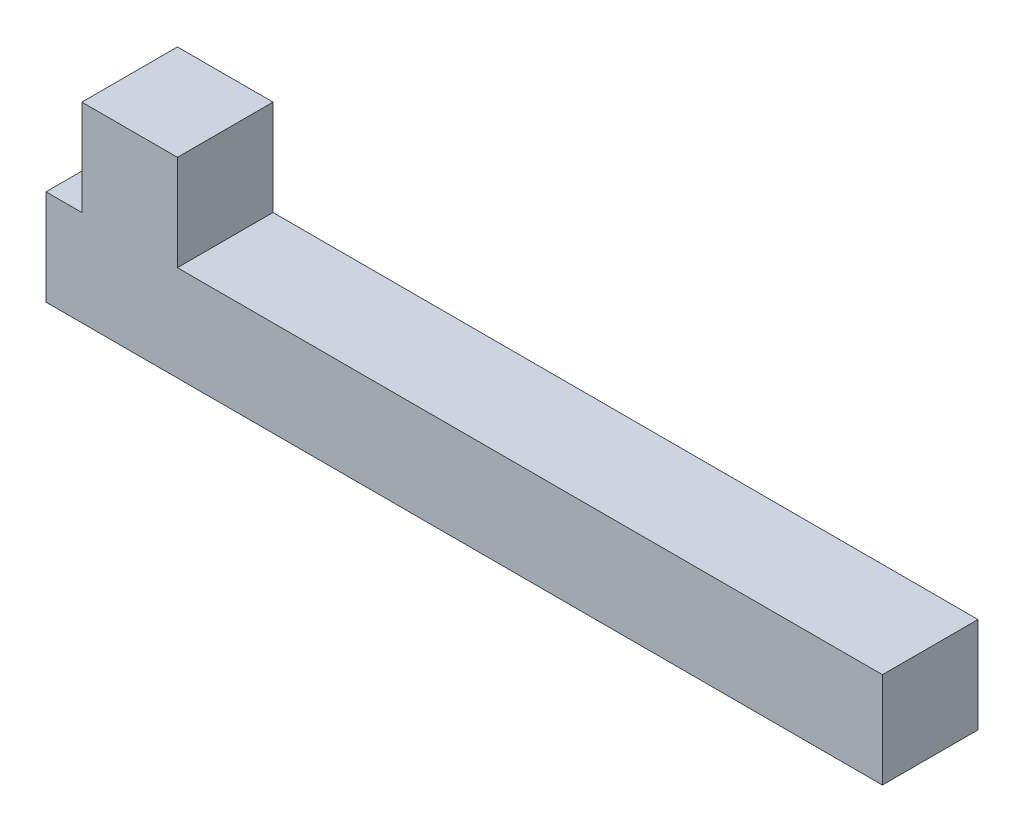
ISO-10303-21;
HEADER;
FILE_DESCRIPTION(('STEP AP214'),'2;1');
FILE_NAME('part.step','',(''),(''),'','','');
FILE_SCHEMA(('AUTOMOTIVE_DESIGN { 1 0 10303 214 1 1 1 1 }'));
ENDSEC;
DATA;
#1=APPLICATION_CONTEXT('core data for automotive mechanical design processes');
#2=APPLICATION_PROTOCOL_DEFINITION('international standard','automotive_design',2000,#1);
#3=PRODUCT_CONTEXT('',#1,'mechanical');
#4=PRODUCT('Part','Part','',(#3));
#5=PRODUCT_RELATED_PRODUCT_CATEGORY('part','',(#4));
#6=PRODUCT_DEFINITION_FORMATION('','',#4);
#7=PRODUCT_DEFINITION_CONTEXT('part definition',#1,'design');
#8=PRODUCT_DEFINITION('design','',#6,#7);
#9=PRODUCT_DEFINITION_SHAPE('','',#8);
#10=(LENGTH_UNIT() NAMED_UNIT(*) SI_UNIT(.MILLI.,.METRE.));
#11=(NAMED_UNIT(*) PLANE_ANGLE_UNIT() SI_UNIT($,.RADIAN.));
#12=(NAMED_UNIT(*) SI_UNIT($,.STERADIAN.) SOLID_ANGLE_UNIT());
#13=UNCERTAINTY_MEASURE_WITH_UNIT(LENGTH_MEASURE(1.E-05),#10,'distance_accuracy_value','');
#14=(GEOMETRIC_REPRESENTATION_CONTEXT(3) GLOBAL_UNCERTAINTY_ASSIGNED_CONTEXT((#13)) GLOBAL_UNIT_ASSIGNED_CONTEXT((#10,
#11,#12)) REPRESENTATION_CONTEXT('',''));
#15=CARTESIAN_POINT('',(0.,0.,0.));
#16=DIRECTION('',(0.,0.,1.));
#17=DIRECTION('',(1.,0.,0.));
#18=AXIS2_PLACEMENT_3D('',#15,#16,#17);
#19=CARTESIAN_POINT('',(35.,0.,4.));
#20=DIRECTION('',(0.,1.,0.));
#21=DIRECTION('',(-1.,0.,0.));
#22=AXIS2_PLACEMENT_3D('',#19,#20,#21);
#23=PLANE('',#22);
#24=DIRECTION('',(1.,0.,0.));
#25=VECTOR('',#24,1.);
#26=CARTESIAN_POINT('',(35.,0.,0.));
#27=LINE('',#26,#25);
#28=CARTESIAN_POINT('',(0.,0.,0.));
#29=VERTEX_POINT('',#28);
#30=CARTESIAN_POINT('',(35.,0.,0.));
#31=VERTEX_POINT('',#30);
#32=EDGE_CURVE('E135',#29,#31,#27,.T.);
#33=ORIENTED_EDGE('',*,*,#32,.T.);
#34=DIRECTION('',(0.,0.,-1.));
#35=VECTOR('',#34,1.);
#36=CARTESIAN_POINT('',(35.,0.,4.));
#37=LINE('',#36,#35);
#38=CARTESIAN_POINT('',(35.,0.,4.));
#39=VERTEX_POINT('',#38);
#40=EDGE_CURVE('E11',#39,#31,#37,.T.);
#41=ORIENTED_EDGE('',*,*,#40,.F.);
#42=DIRECTION('',(1.,0.,0.));
#43=VECTOR('',#42,1.);
#44=CARTESIAN_POINT('',(35.,0.,4.));
#45=LINE('',#44,#43);
#46=CARTESIAN_POINT('',(0.,0.,4.));
#47=VERTEX_POINT('',#46);
#48=EDGE_CURVE('E149',#47,#39,#45,.T.);
#49=ORIENTED_EDGE('',*,*,#48,.F.);
#50=DIRECTION('',(0.,0.,-1.));
#51=VECTOR('',#50,1.);
#52=CARTESIAN_POINT('',(0.,0.,4.));
#53=LINE('',#52,#51);
#54=EDGE_CURVE('E131',#47,#29,#53,.T.);
#55=ORIENTED_EDGE('',*,*,#54,.T.);
#56=EDGE_LOOP('',(#33,#41,#49,#55));
#57=FACE_BOUND('',#56,.T.);
#58=ADVANCED_FACE('F39',(#57),#23,.F.);
#59=CARTESIAN_POINT('',(35.,4.,4.));
#60=DIRECTION('',(-1.,0.,0.));
#61=DIRECTION('',(0.,-1.,0.));
#62=AXIS2_PLACEMENT_3D('',#59,#60,#61);
#63=PLANE('',#62);
#64=DIRECTION('',(0.,1.,0.));
#65=VECTOR('',#64,1.);
#66=CARTESIAN_POINT('',(35.,4.,0.));
#67=LINE('',#66,#65);
#68=CARTESIAN_POINT('',(35.,4.,0.));
#69=VERTEX_POINT('',#68);
#70=EDGE_CURVE('E138',#31,#69,#67,.T.);
#71=ORIENTED_EDGE('',*,*,#70,.T.);
#72=DIRECTION('',(0.,0.,-1.));
#73=VECTOR('',#72,1.);
#74=CARTESIAN_POINT('',(35.,4.,4.));
#75=LINE('',#74,#73);
#76=CARTESIAN_POINT('',(35.,4.,4.));
#77=VERTEX_POINT('',#76);
#78=EDGE_CURVE('E47',#77,#69,#75,.T.);
#79=ORIENTED_EDGE('',*,*,#78,.F.);
#80=DIRECTION('',(0.,1.,0.));
#81=VECTOR('',#80,1.);
#82=CARTESIAN_POINT('',(35.,4.,4.));
#83=LINE('',#82,#81);
#84=EDGE_CURVE('E98',#39,#77,#83,.T.);
#85=ORIENTED_EDGE('',*,*,#84,.F.);
#86=ORIENTED_EDGE('',*,*,#40,.T.);
#87=EDGE_LOOP('',(#71,#79,#85,#86));
#88=FACE_BOUND('',#87,.T.);
#89=ADVANCED_FACE('F184',(#88),#63,.F.);
#90=CARTESIAN_POINT('',(5.5,4.,4.));
#91=DIRECTION('',(0.,-1.,0.));
#92=DIRECTION('',(1.,0.,0.));
#93=AXIS2_PLACEMENT_3D('',#90,#91,#92);
#94=PLANE('',#93);
#95=DIRECTION('',(-1.,0.,0.));
#96=VECTOR('',#95,1.);
#97=CARTESIAN_POINT('',(5.5,4.,0.));
#98=LINE('',#97,#96);
#99=CARTESIAN_POINT('',(5.5,4.,0.));
#100=VERTEX_POINT('',#99);
#101=EDGE_CURVE('E140',#69,#100,#98,.T.);
#102=ORIENTED_EDGE('',*,*,#101,.T.);
#103=DIRECTION('',(0.,0.,-1.));
#104=VECTOR('',#103,1.);
#105=CARTESIAN_POINT('',(5.5,4.,4.));
#106=LINE('',#105,#104);
#107=CARTESIAN_POINT('',(5.5,4.,4.));
#108=VERTEX_POINT('',#107);
#109=EDGE_CURVE('E156',#108,#100,#106,.T.);
#110=ORIENTED_EDGE('',*,*,#109,.F.);
#111=DIRECTION('',(-1.,0.,0.));
#112=VECTOR('',#111,1.);
#113=CARTESIAN_POINT('',(5.5,4.,4.));
#114=LINE('',#113,#112);
#115=EDGE_CURVE('E164',#77,#108,#114,.T.);
#116=ORIENTED_EDGE('',*,*,#115,.F.);
#117=ORIENTED_EDGE('',*,*,#78,.T.);
#118=EDGE_LOOP('',(#102,#110,#116,#117));
#119=FACE_BOUND('',#118,.T.);
#120=ADVANCED_FACE('F162',(#119),#94,.F.);
#121=CARTESIAN_POINT('',(5.5,8.,4.));
#122=DIRECTION('',(-1.,0.,0.));
#123=DIRECTION('',(0.,-1.,0.));
#124=AXIS2_PLACEMENT_3D('',#121,#122,#123);
#125=PLANE('',#124);
#126=DIRECTION('',(0.,1.,0.));
#127=VECTOR('',#126,1.);
#128=CARTESIAN_POINT('',(5.5,8.,0.));
#129=LINE('',#128,#127);
#130=CARTESIAN_POINT('',(5.5,8.,0.));
#131=VERTEX_POINT('',#130);
#132=EDGE_CURVE('E142',#100,#131,#129,.T.);
#133=ORIENTED_EDGE('',*,*,#132,.T.);
#134=DIRECTION('',(0.,0.,-1.));
#135=VECTOR('',#134,1.);
#136=CARTESIAN_POINT('',(5.5,8.,4.));
#137=LINE('',#136,#135);
#138=CARTESIAN_POINT('',(5.5,8.,4.));
#139=VERTEX_POINT('',#138);
#140=EDGE_CURVE('E153',#139,#131,#137,.T.);
#141=ORIENTED_EDGE('',*,*,#140,.F.);
#142=DIRECTION('',(0.,1.,0.));
#143=VECTOR('',#142,1.);
#144=CARTESIAN_POINT('',(5.5,8.,4.));
#145=LINE('',#144,#143);
#146=EDGE_CURVE('E176',#108,#139,#145,.T.);
#147=ORIENTED_EDGE('',*,*,#146,.F.);
#148=ORIENTED_EDGE('',*,*,#109,.T.);
#149=EDGE_LOOP('',(#133,#141,#147,#148));
#150=FACE_BOUND('',#149,.T.);
#151=ADVANCED_FACE('F172',(#150),#125,.F.);
#152=CARTESIAN_POINT('',(1.5,8.,4.));
#153=DIRECTION('',(0.,-1.,0.));
#154=DIRECTION('',(0.,0.,-1.));
#155=AXIS2_PLACEMENT_3D('',#152,#153,#154);
#156=PLANE('',#155);
#157=DIRECTION('',(-1.,0.,0.));
#158=VECTOR('',#157,1.);
#159=CARTESIAN_POINT('',(1.5,8.,0.));
#160=LINE('',#159,#158);
#161=CARTESIAN_POINT('',(1.5,8.,0.));
#162=VERTEX_POINT('',#161);
#163=EDGE_CURVE('E144',#131,#162,#160,.T.);
#164=ORIENTED_EDGE('',*,*,#163,.T.);
#165=DIRECTION('',(0.,0.,-1.));
#166=VECTOR('',#165,1.);
#167=CARTESIAN_POINT('',(1.5,8.,4.));
#168=LINE('',#167,#166);
#169=CARTESIAN_POINT('',(1.5,8.,4.));
#170=VERTEX_POINT('',#169);
#171=EDGE_CURVE('E126',#170,#162,#168,.T.);
#172=ORIENTED_EDGE('',*,*,#171,.F.);
#173=DIRECTION('',(-1.,0.,0.));
#174=VECTOR('',#173,1.);
#175=CARTESIAN_POINT('',(1.5,8.,4.));
#176=LINE('',#175,#174);
#177=EDGE_CURVE('E117',#139,#170,#176,.T.);
#178=ORIENTED_EDGE('',*,*,#177,.F.);
#179=ORIENTED_EDGE('',*,*,#140,.T.);
#180=EDGE_LOOP('',(#164,#172,#178,#179));
#181=FACE_BOUND('',#180,.T.);
#182=ADVANCED_FACE('F175',(#181),#156,.F.);
#183=CARTESIAN_POINT('',(1.5,4.,4.));
#184=DIRECTION('',(1.,0.,0.));
#185=DIRECTION('',(0.,1.,0.));
#186=AXIS2_PLACEMENT_3D('',#183,#184,#185);
#187=PLANE('',#186);
#188=DIRECTION('',(0.,-1.,0.));
#189=VECTOR('',#188,1.);
#190=CARTESIAN_POINT('',(1.5,4.,0.));
#191=LINE('',#190,#189);
#192=CARTESIAN_POINT('',(1.5,4.,0.));
#193=VERTEX_POINT('',#192);
#194=EDGE_CURVE('E125',#162,#193,#191,.T.);
#195=ORIENTED_EDGE('',*,*,#194,.T.);
#196=DIRECTION('',(0.,0.,-1.));
#197=VECTOR('',#196,1.);
#198=CARTESIAN_POINT('',(1.5,4.,4.));
#199=LINE('',#198,#197);
#200=CARTESIAN_POINT('',(1.5,4.,4.));
#201=VERTEX_POINT('',#200);
#202=EDGE_CURVE('E122',#201,#193,#199,.T.);
#203=ORIENTED_EDGE('',*,*,#202,.F.);
#204=DIRECTION('',(0.,-1.,0.));
#205=VECTOR('',#204,1.);
#206=CARTESIAN_POINT('',(1.5,4.,4.));
#207=LINE('',#206,#205);
#208=EDGE_CURVE('E111',#170,#201,#207,.T.);
#209=ORIENTED_EDGE('',*,*,#208,.F.);
#210=ORIENTED_EDGE('',*,*,#171,.T.);
#211=EDGE_LOOP('',(#195,#203,#209,#210));
#212=FACE_BOUND('',#211,.T.);
#213=ADVANCED_FACE('F123',(#212),#187,.F.);
#214=CARTESIAN_POINT('',(0.,4.,4.));
#215=DIRECTION('',(0.,-1.,0.));
#216=DIRECTION('',(1.,0.,0.));
#217=AXIS2_PLACEMENT_3D('',#214,#215,#216);
#218=PLANE('',#217);
#219=DIRECTION('',(-1.,0.,0.));
#220=VECTOR('',#219,1.);
#221=CARTESIAN_POINT('',(0.,4.,0.));
#222=LINE('',#221,#220);
#223=CARTESIAN_POINT('',(0.,4.,0.));
#224=VERTEX_POINT('',#223);
#225=EDGE_CURVE('E84',#193,#224,#222,.T.);
#226=ORIENTED_EDGE('',*,*,#225,.T.);
#227=DIRECTION('',(0.,0.,-1.));
#228=VECTOR('',#227,1.);
#229=CARTESIAN_POINT('',(0.,4.,4.));
#230=LINE('',#229,#228);
#231=CARTESIAN_POINT('',(0.,4.,4.));
#232=VERTEX_POINT('',#231);
#233=EDGE_CURVE('E127',#232,#224,#230,.T.);
#234=ORIENTED_EDGE('',*,*,#233,.F.);
#235=DIRECTION('',(-1.,0.,0.));
#236=VECTOR('',#235,1.);
#237=CARTESIAN_POINT('',(0.,4.,4.));
#238=LINE('',#237,#236);
#239=EDGE_CURVE('E115',#201,#232,#238,.T.);
#240=ORIENTED_EDGE('',*,*,#239,.F.);
#241=ORIENTED_EDGE('',*,*,#202,.T.);
#242=EDGE_LOOP('',(#226,#234,#240,#241));
#243=FACE_BOUND('',#242,.T.);
#244=ADVANCED_FACE('F129',(#243),#218,.F.);
#245=CARTESIAN_POINT('',(0.,0.,4.));
#246=DIRECTION('',(1.,0.,0.));
#247=DIRECTION('',(0.,0.,-1.));
#248=AXIS2_PLACEMENT_3D('',#245,#246,#247);
#249=PLANE('',#248);
#250=DIRECTION('',(0.,-1.,0.));
#251=VECTOR('',#250,1.);
#252=CARTESIAN_POINT('',(0.,0.,0.));
#253=LINE('',#252,#251);
#254=EDGE_CURVE('E90',#224,#29,#253,.T.);
#255=ORIENTED_EDGE('',*,*,#254,.T.);
#256=ORIENTED_EDGE('',*,*,#54,.F.);
#257=DIRECTION('',(0.,-1.,0.));
#258=VECTOR('',#257,1.);
#259=CARTESIAN_POINT('',(0.,0.,4.));
#260=LINE('',#259,#258);
#261=EDGE_CURVE('E55',#232,#47,#260,.T.);
#262=ORIENTED_EDGE('',*,*,#261,.F.);
#263=ORIENTED_EDGE('',*,*,#233,.T.);
#264=EDGE_LOOP('',(#255,#256,#262,#263));
#265=FACE_BOUND('',#264,.T.);
#266=ADVANCED_FACE('F200',(#265),#249,.F.);
#267=CARTESIAN_POINT('',(0.,0.,4.));
#268=DIRECTION('',(0.,0.,-1.));
#269=DIRECTION('',(-1.,0.,0.));
#270=AXIS2_PLACEMENT_3D('',#267,#268,#269);
#271=PLANE('',#270);
#272=ORIENTED_EDGE('',*,*,#48,.T.);
#273=ORIENTED_EDGE('',*,*,#84,.T.);
#274=ORIENTED_EDGE('',*,*,#115,.T.);
#275=ORIENTED_EDGE('',*,*,#146,.T.);
#276=ORIENTED_EDGE('',*,*,#177,.T.);
#277=ORIENTED_EDGE('',*,*,#208,.T.);
#278=ORIENTED_EDGE('',*,*,#239,.T.);
#279=ORIENTED_EDGE('',*,*,#261,.T.);
#280=EDGE_LOOP('',(#272,#273,#274,#275,#276,#277,#278,#279));
#281=FACE_BOUND('',#280,.T.);
#282=ADVANCED_FACE('F113',(#281),#271,.F.);
#283=CARTESIAN_POINT('',(0.,0.,0.));
#284=DIRECTION('',(0.,0.,-1.));
#285=DIRECTION('',(-1.,0.,0.));
#286=AXIS2_PLACEMENT_3D('',#283,#284,#285);
#287=PLANE('',#286);
#288=ORIENTED_EDGE('',*,*,#32,.F.);
#289=ORIENTED_EDGE('',*,*,#254,.F.);
#290=ORIENTED_EDGE('',*,*,#225,.F.);
#291=ORIENTED_EDGE('',*,*,#194,.F.);
#292=ORIENTED_EDGE('',*,*,#163,.F.);
#293=ORIENTED_EDGE('',*,*,#132,.F.);
#294=ORIENTED_EDGE('',*,*,#101,.F.);
#295=ORIENTED_EDGE('',*,*,#70,.F.);
#296=EDGE_LOOP('',(#288,#289,#290,#291,#292,#293,#294,#295));
#297=FACE_BOUND('',#296,.T.);
#298=ADVANCED_FACE('F168',(#297),#287,.T.);
#299=CLOSED_SHELL('',(#58,#89,#120,#151,#182,#213,#244,#266,#282,#298));
#300=MANIFOLD_SOLID_BREP('B2',#299);
#301=ADVANCED_BREP_SHAPE_REPRESENTATION('',(#18,#300),#14);
#302=SHAPE_DEFINITION_REPRESENTATION(#9,#301);
ENDSEC;
END-ISO-10303-21;
